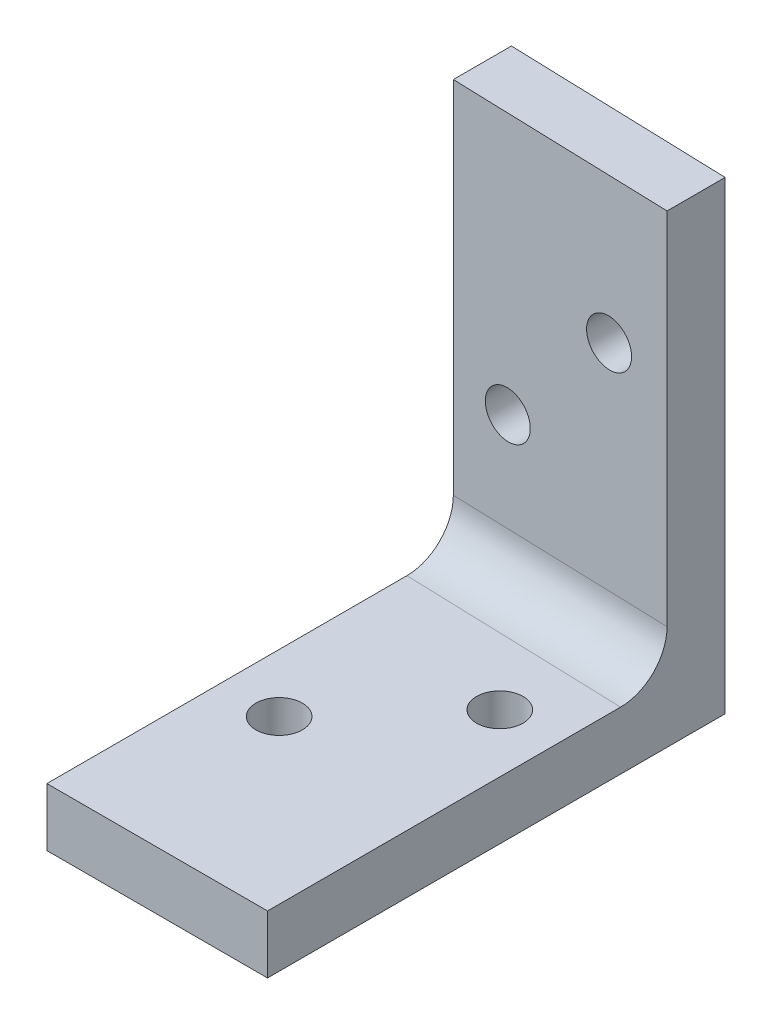
ISO-10303-21;
HEADER;
FILE_DESCRIPTION(('STEP AP214'),'2;1');
FILE_NAME('part.step','',(''),(''),'','','');
FILE_SCHEMA(('AUTOMOTIVE_DESIGN { 1 0 10303 214 1 1 1 1 }'));
ENDSEC;
DATA;
#1=APPLICATION_CONTEXT('core data for automotive mechanical design processes');
#2=APPLICATION_PROTOCOL_DEFINITION('international standard','automotive_design',2000,#1);
#3=PRODUCT_CONTEXT('',#1,'mechanical');
#4=PRODUCT('Part','Part','',(#3));
#5=PRODUCT_RELATED_PRODUCT_CATEGORY('part','',(#4));
#6=PRODUCT_DEFINITION_FORMATION('','',#4);
#7=PRODUCT_DEFINITION_CONTEXT('part definition',#1,'design');
#8=PRODUCT_DEFINITION('design','',#6,#7);
#9=PRODUCT_DEFINITION_SHAPE('','',#8);
#10=(LENGTH_UNIT() NAMED_UNIT(*) SI_UNIT(.MILLI.,.METRE.));
#11=(NAMED_UNIT(*) PLANE_ANGLE_UNIT() SI_UNIT($,.RADIAN.));
#12=(NAMED_UNIT(*) SI_UNIT($,.STERADIAN.) SOLID_ANGLE_UNIT());
#13=UNCERTAINTY_MEASURE_WITH_UNIT(LENGTH_MEASURE(1.E-05),#10,'distance_accuracy_value','');
#14=(GEOMETRIC_REPRESENTATION_CONTEXT(3) GLOBAL_UNCERTAINTY_ASSIGNED_CONTEXT((#13)) GLOBAL_UNIT_ASSIGNED_CONTEXT((#10,
#11,#12)) REPRESENTATION_CONTEXT('',''));
#15=CARTESIAN_POINT('',(0.,0.,0.));
#16=DIRECTION('',(0.,0.,1.));
#17=DIRECTION('',(1.,0.,0.));
#18=AXIS2_PLACEMENT_3D('',#15,#16,#17);
#19=CARTESIAN_POINT('',(0.,5.,0.));
#20=DIRECTION('',(0.,-1.,0.));
#21=DIRECTION('',(0.,0.,-1.));
#22=AXIS2_PLACEMENT_3D('',#19,#20,#21);
#23=PLANE('',#22);
#24=CARTESIAN_POINT('',(-4.5,5.,5.));
#25=DIRECTION('',(0.,1.,0.));
#26=DIRECTION('',(0.,0.,1.));
#27=AXIS2_PLACEMENT_3D('',#24,#25,#26);
#28=CIRCLE('',#27,2.);
#29=CARTESIAN_POINT('',(-4.5,5.,7.));
#30=VERTEX_POINT('',#29);
#31=EDGE_CURVE('E199',#30,#30,#28,.T.);
#32=ORIENTED_EDGE('',*,*,#31,.F.);
#33=EDGE_LOOP('',(#32));
#34=FACE_BOUND('',#33,.T.);
#35=CARTESIAN_POINT('',(4.5,5.,-5.));
#36=DIRECTION('',(0.,1.,0.));
#37=DIRECTION('',(0.,0.,1.));
#38=AXIS2_PLACEMENT_3D('',#35,#36,#37);
#39=CIRCLE('',#38,2.);
#40=CARTESIAN_POINT('',(4.5,5.,-3.));
#41=VERTEX_POINT('',#40);
#42=EDGE_CURVE('E195',#41,#41,#39,.T.);
#43=ORIENTED_EDGE('',*,*,#42,.F.);
#44=EDGE_LOOP('',(#43));
#45=FACE_BOUND('',#44,.T.);
#46=DIRECTION('',(0.,0.,-1.));
#47=VECTOR('',#46,1.);
#48=CARTESIAN_POINT('',(9.5,5.,20.));
#49=LINE('',#48,#47);
#50=CARTESIAN_POINT('',(9.5,5.,20.));
#51=VERTEX_POINT('',#50);
#52=CARTESIAN_POINT('',(9.5,5.,-10.4009262122279));
#53=VERTEX_POINT('',#52);
#54=EDGE_CURVE('E142',#51,#53,#49,.T.);
#55=ORIENTED_EDGE('',*,*,#54,.T.);
#56=DIRECTION('',(0.999506560365732,0.,0.0314107590781211));
#57=VECTOR('',#56,1.);
#58=CARTESIAN_POINT('',(-9.62564303631249,5.,-11.0019737585371));
#59=LINE('',#58,#57);
#60=CARTESIAN_POINT('',(-9.5,5.,-10.9980252670514));
#61=VERTEX_POINT('',#60);
#62=EDGE_CURVE('E64',#53,#61,#59,.F.);
#63=ORIENTED_EDGE('',*,*,#62,.T.);
#64=DIRECTION('',(0.,0.,1.));
#65=VECTOR('',#64,1.);
#66=CARTESIAN_POINT('',(-9.5,5.,20.));
#67=LINE('',#66,#65);
#68=CARTESIAN_POINT('',(-9.5,5.,20.));
#69=VERTEX_POINT('',#68);
#70=EDGE_CURVE('E145',#61,#69,#67,.T.);
#71=ORIENTED_EDGE('',*,*,#70,.T.);
#72=DIRECTION('',(1.,0.,0.));
#73=VECTOR('',#72,1.);
#74=CARTESIAN_POINT('',(-9.5,5.,20.));
#75=LINE('',#74,#73);
#76=EDGE_CURVE('E149',#69,#51,#75,.T.);
#77=ORIENTED_EDGE('',*,*,#76,.T.);
#78=EDGE_LOOP('',(#55,#63,#71,#77));
#79=FACE_BOUND('',#78,.T.);
#80=ADVANCED_FACE('F42',(#34,#45,#79),#23,.F.);
#81=CARTESIAN_POINT('',(9.5,5.,20.));
#82=DIRECTION('',(-1.,0.,0.));
#83=DIRECTION('',(0.,0.,1.));
#84=AXIS2_PLACEMENT_3D('',#81,#82,#83);
#85=PLANE('',#84);
#86=DIRECTION('',(0.,0.,-1.));
#87=VECTOR('',#86,1.);
#88=CARTESIAN_POINT('',(9.5,0.,20.));
#89=LINE('',#88,#87);
#90=CARTESIAN_POINT('',(9.5,0.,20.));
#91=VERTEX_POINT('',#90);
#92=CARTESIAN_POINT('',(9.5,0.,-19.4029009451765));
#93=VERTEX_POINT('',#92);
#94=EDGE_CURVE('E141',#91,#93,#89,.T.);
#95=ORIENTED_EDGE('',*,*,#94,.T.);
#96=DIRECTION('',(0.,1.,0.));
#97=VECTOR('',#96,1.);
#98=CARTESIAN_POINT('',(9.5,0.,-19.4029009451765));
#99=LINE('',#98,#97);
#100=CARTESIAN_POINT('',(9.5,40.,-19.4029009451765));
#101=VERTEX_POINT('',#100);
#102=EDGE_CURVE('E134',#93,#101,#99,.T.);
#103=ORIENTED_EDGE('',*,*,#102,.T.);
#104=DIRECTION('',(0.,0.,-1.));
#105=VECTOR('',#104,1.);
#106=CARTESIAN_POINT('',(9.5,40.,-19.4029009451765));
#107=LINE('',#106,#105);
#108=CARTESIAN_POINT('',(9.5,40.,-14.4029009451765));
#109=VERTEX_POINT('',#108);
#110=EDGE_CURVE('E113',#109,#101,#107,.T.);
#111=ORIENTED_EDGE('',*,*,#110,.F.);
#112=DIRECTION('',(0.,-1.,0.));
#113=VECTOR('',#112,1.);
#114=CARTESIAN_POINT('',(9.5,40.,-14.4029009451765));
#115=LINE('',#114,#113);
#116=CARTESIAN_POINT('',(9.5,9.,-14.4029009451765));
#117=VERTEX_POINT('',#116);
#118=EDGE_CURVE('E108',#109,#117,#115,.T.);
#119=ORIENTED_EDGE('',*,*,#118,.T.);
#120=CARTESIAN_POINT('',(9.5,9.,-10.4009262122279));
#121=DIRECTION('',(-1.,0.,0.));
#122=DIRECTION('',(0.,0.,-1.));
#123=AXIS2_PLACEMENT_3D('',#120,#121,#122);
#124=ELLIPSE('',#123,4.00197473294858,4.);
#125=EDGE_CURVE('E51',#117,#53,#124,.T.);
#126=ORIENTED_EDGE('',*,*,#125,.T.);
#127=ORIENTED_EDGE('',*,*,#54,.F.);
#128=DIRECTION('',(0.,-1.,0.));
#129=VECTOR('',#128,1.);
#130=CARTESIAN_POINT('',(9.5,5.,20.));
#131=LINE('',#130,#129);
#132=EDGE_CURVE('E152',#51,#91,#131,.T.);
#133=ORIENTED_EDGE('',*,*,#132,.T.);
#134=EDGE_LOOP('',(#95,#103,#111,#119,#126,#127,#133));
#135=FACE_BOUND('',#134,.T.);
#136=ADVANCED_FACE('F187',(#135),#85,.F.);
#137=CARTESIAN_POINT('',(-9.5,5.,20.));
#138=DIRECTION('',(1.,0.,0.));
#139=DIRECTION('',(0.,0.,-1.));
#140=AXIS2_PLACEMENT_3D('',#137,#138,#139);
#141=PLANE('',#140);
#142=DIRECTION('',(0.,0.,1.));
#143=VECTOR('',#142,1.);
#144=CARTESIAN_POINT('',(-9.5,0.,20.));
#145=LINE('',#144,#143);
#146=CARTESIAN_POINT('',(-9.5,0.,-20.));
#147=VERTEX_POINT('',#146);
#148=CARTESIAN_POINT('',(-9.5,0.,20.));
#149=VERTEX_POINT('',#148);
#150=EDGE_CURVE('E156',#147,#149,#145,.T.);
#151=ORIENTED_EDGE('',*,*,#150,.T.);
#152=DIRECTION('',(0.,-1.,0.));
#153=VECTOR('',#152,1.);
#154=CARTESIAN_POINT('',(-9.5,5.,20.));
#155=LINE('',#154,#153);
#156=EDGE_CURVE('E164',#69,#149,#155,.T.);
#157=ORIENTED_EDGE('',*,*,#156,.F.);
#158=ORIENTED_EDGE('',*,*,#70,.F.);
#159=CARTESIAN_POINT('',(-9.5,9.,-10.9980252670514));
#160=DIRECTION('',(1.,0.,0.));
#161=DIRECTION('',(0.,0.,-1.));
#162=AXIS2_PLACEMENT_3D('',#159,#160,#161);
#163=ELLIPSE('',#162,4.00197473294858,4.);
#164=CARTESIAN_POINT('',(-9.5,9.,-15.));
#165=VERTEX_POINT('',#164);
#166=EDGE_CURVE('E11',#61,#165,#163,.T.);
#167=ORIENTED_EDGE('',*,*,#166,.T.);
#168=DIRECTION('',(0.,-1.,0.));
#169=VECTOR('',#168,1.);
#170=CARTESIAN_POINT('',(-9.5,40.,-15.));
#171=LINE('',#170,#169);
#172=CARTESIAN_POINT('',(-9.5,40.,-15.));
#173=VERTEX_POINT('',#172);
#174=EDGE_CURVE('E106',#173,#165,#171,.T.);
#175=ORIENTED_EDGE('',*,*,#174,.F.);
#176=DIRECTION('',(0.,0.,1.));
#177=VECTOR('',#176,1.);
#178=CARTESIAN_POINT('',(-9.5,40.,-15.));
#179=LINE('',#178,#177);
#180=CARTESIAN_POINT('',(-9.5,40.,-20.));
#181=VERTEX_POINT('',#180);
#182=EDGE_CURVE('E114',#181,#173,#179,.T.);
#183=ORIENTED_EDGE('',*,*,#182,.F.);
#184=DIRECTION('',(0.,-1.,0.));
#185=VECTOR('',#184,1.);
#186=CARTESIAN_POINT('',(-9.5,5.,-20.));
#187=LINE('',#186,#185);
#188=EDGE_CURVE('E168',#181,#147,#187,.T.);
#189=ORIENTED_EDGE('',*,*,#188,.T.);
#190=EDGE_LOOP('',(#151,#157,#158,#167,#175,#183,#189));
#191=FACE_BOUND('',#190,.T.);
#192=ADVANCED_FACE('F126',(#191),#141,.F.);
#193=CARTESIAN_POINT('',(-9.5,5.,20.));
#194=DIRECTION('',(0.,0.,-1.));
#195=DIRECTION('',(-1.,0.,0.));
#196=AXIS2_PLACEMENT_3D('',#193,#194,#195);
#197=PLANE('',#196);
#198=DIRECTION('',(1.,0.,0.));
#199=VECTOR('',#198,1.);
#200=CARTESIAN_POINT('',(-9.5,0.,20.));
#201=LINE('',#200,#199);
#202=EDGE_CURVE('E146',#149,#91,#201,.T.);
#203=ORIENTED_EDGE('',*,*,#202,.T.);
#204=ORIENTED_EDGE('',*,*,#132,.F.);
#205=ORIENTED_EDGE('',*,*,#76,.F.);
#206=ORIENTED_EDGE('',*,*,#156,.T.);
#207=EDGE_LOOP('',(#203,#204,#205,#206));
#208=FACE_BOUND('',#207,.T.);
#209=ADVANCED_FACE('F231',(#208),#197,.F.);
#210=CARTESIAN_POINT('',(0.,0.,0.));
#211=DIRECTION('',(0.,-1.,0.));
#212=DIRECTION('',(0.,0.,-1.));
#213=AXIS2_PLACEMENT_3D('',#210,#211,#212);
#214=PLANE('',#213);
#215=CARTESIAN_POINT('',(-4.5,0.,5.));
#216=DIRECTION('',(0.,1.,0.));
#217=DIRECTION('',(0.,0.,1.));
#218=AXIS2_PLACEMENT_3D('',#215,#216,#217);
#219=CIRCLE('',#218,2.);
#220=CARTESIAN_POINT('',(-4.5,0.,7.));
#221=VERTEX_POINT('',#220);
#222=EDGE_CURVE('E124',#221,#221,#219,.T.);
#223=ORIENTED_EDGE('',*,*,#222,.T.);
#224=EDGE_LOOP('',(#223));
#225=FACE_BOUND('',#224,.T.);
#226=CARTESIAN_POINT('',(4.5,0.,-5.));
#227=DIRECTION('',(0.,1.,0.));
#228=DIRECTION('',(0.,0.,1.));
#229=AXIS2_PLACEMENT_3D('',#226,#227,#228);
#230=CIRCLE('',#229,2.);
#231=CARTESIAN_POINT('',(4.5,0.,-3.));
#232=VERTEX_POINT('',#231);
#233=EDGE_CURVE('E181',#232,#232,#230,.T.);
#234=ORIENTED_EDGE('',*,*,#233,.T.);
#235=EDGE_LOOP('',(#234));
#236=FACE_BOUND('',#235,.T.);
#237=DIRECTION('',(0.999506560365732,0.,0.0314107590781213));
#238=VECTOR('',#237,1.);
#239=CARTESIAN_POINT('',(-9.5,0.,-20.));
#240=LINE('',#239,#238);
#241=EDGE_CURVE('E129',#147,#93,#240,.T.);
#242=ORIENTED_EDGE('',*,*,#241,.T.);
#243=ORIENTED_EDGE('',*,*,#94,.F.);
#244=ORIENTED_EDGE('',*,*,#202,.F.);
#245=ORIENTED_EDGE('',*,*,#150,.F.);
#246=EDGE_LOOP('',(#242,#243,#244,#245));
#247=FACE_BOUND('',#246,.T.);
#248=ADVANCED_FACE('F220',(#225,#236,#247),#214,.T.);
#249=CARTESIAN_POINT('',(-9.5,0.,-20.));
#250=DIRECTION('',(-0.0314107590781213,0.,0.999506560365732));
#251=DIRECTION('',(0.999506560365732,0.,0.0314107590781213));
#252=AXIS2_PLACEMENT_3D('',#249,#250,#251);
#253=PLANE('',#252);
#254=CARTESIAN_POINT('',(4.50246719817134,27.5,-19.5599547405671));
#255=DIRECTION('',(0.0314107590781213,0.,-0.999506560365732));
#256=DIRECTION('',(-0.999506560365732,0.,-0.0314107590781213));
#257=AXIS2_PLACEMENT_3D('',#254,#255,#256);
#258=CIRCLE('',#257,2.);
#259=CARTESIAN_POINT('',(2.50345407743987,27.5,-19.6227762587233));
#260=VERTEX_POINT('',#259);
#261=EDGE_CURVE('E177',#260,#260,#258,.T.);
#262=ORIENTED_EDGE('',*,*,#261,.F.);
#263=EDGE_LOOP('',(#262));
#264=FACE_BOUND('',#263,.T.);
#265=CARTESIAN_POINT('',(-4.50246719817134,17.5,-19.8429462046094));
#266=DIRECTION('',(0.0314107590781213,0.,-0.999506560365732));
#267=DIRECTION('',(-0.999506560365732,0.,-0.0314107590781213));
#268=AXIS2_PLACEMENT_3D('',#265,#266,#267);
#269=CIRCLE('',#268,2.);
#270=CARTESIAN_POINT('',(-6.5014803189028,17.5,-19.9057677227656));
#271=VERTEX_POINT('',#270);
#272=EDGE_CURVE('E206',#271,#271,#269,.T.);
#273=ORIENTED_EDGE('',*,*,#272,.F.);
#274=EDGE_LOOP('',(#273));
#275=FACE_BOUND('',#274,.T.);
#276=ORIENTED_EDGE('',*,*,#188,.F.);
#277=DIRECTION('',(-0.999506560365732,0.,-0.0314107590781213));
#278=VECTOR('',#277,1.);
#279=CARTESIAN_POINT('',(-9.5,40.,-20.));
#280=LINE('',#279,#278);
#281=EDGE_CURVE('E120',#101,#181,#280,.T.);
#282=ORIENTED_EDGE('',*,*,#281,.F.);
#283=ORIENTED_EDGE('',*,*,#102,.F.);
#284=ORIENTED_EDGE('',*,*,#241,.F.);
#285=EDGE_LOOP('',(#276,#282,#283,#284));
#286=FACE_BOUND('',#285,.T.);
#287=ADVANCED_FACE('F217',(#264,#275,#286),#253,.F.);
#288=CARTESIAN_POINT('',(9.5,40.,-14.4029009451765));
#289=DIRECTION('',(0.0314107590781211,0.,-0.999506560365732));
#290=DIRECTION('',(-0.999506560365732,0.,-0.0314107590781211));
#291=AXIS2_PLACEMENT_3D('',#288,#289,#290);
#292=PLANE('',#291);
#293=CARTESIAN_POINT('',(4.34549089934809,27.5,-14.5648879194964));
#294=DIRECTION('',(0.0314107590781211,0.,-0.999506560365732));
#295=DIRECTION('',(-0.999506560365732,0.,-0.0314107590781211));
#296=AXIS2_PLACEMENT_3D('',#293,#294,#295);
#297=CIRCLE('',#296,2.);
#298=CARTESIAN_POINT('',(2.34647777861663,27.5,-14.6277094376526));
#299=VERTEX_POINT('',#298);
#300=EDGE_CURVE('E176',#299,#299,#297,.T.);
#301=ORIENTED_EDGE('',*,*,#300,.T.);
#302=EDGE_LOOP('',(#301));
#303=FACE_BOUND('',#302,.T.);
#304=CARTESIAN_POINT('',(-4.65944349699459,17.5,-14.8478793835387));
#305=DIRECTION('',(0.0314107590781211,0.,-0.999506560365732));
#306=DIRECTION('',(-0.999506560365732,0.,-0.0314107590781211));
#307=AXIS2_PLACEMENT_3D('',#304,#305,#306);
#308=CIRCLE('',#307,2.);
#309=CARTESIAN_POINT('',(-6.65845661772605,17.5,-14.910700901695));
#310=VERTEX_POINT('',#309);
#311=EDGE_CURVE('E172',#310,#310,#308,.T.);
#312=ORIENTED_EDGE('',*,*,#311,.T.);
#313=EDGE_LOOP('',(#312));
#314=FACE_BOUND('',#313,.T.);
#315=ORIENTED_EDGE('',*,*,#174,.T.);
#316=DIRECTION('',(0.999506560365732,0.,0.0314107590781211));
#317=VECTOR('',#316,1.);
#318=CARTESIAN_POINT('',(9.5,9.,-14.4029009451765));
#319=LINE('',#318,#317);
#320=EDGE_CURVE('E171',#165,#117,#319,.T.);
#321=ORIENTED_EDGE('',*,*,#320,.T.);
#322=ORIENTED_EDGE('',*,*,#118,.F.);
#323=DIRECTION('',(0.999506560365732,0.,0.0314107590781211));
#324=VECTOR('',#323,1.);
#325=CARTESIAN_POINT('',(9.5,40.,-14.4029009451765));
#326=LINE('',#325,#324);
#327=EDGE_CURVE('E101',#173,#109,#326,.T.);
#328=ORIENTED_EDGE('',*,*,#327,.F.);
#329=EDGE_LOOP('',(#315,#321,#322,#328));
#330=FACE_BOUND('',#329,.T.);
#331=ADVANCED_FACE('F103',(#303,#314,#330),#292,.F.);
#332=CARTESIAN_POINT('',(0.,40.,0.));
#333=DIRECTION('',(0.,-1.,0.));
#334=DIRECTION('',(0.,0.,-1.));
#335=AXIS2_PLACEMENT_3D('',#332,#333,#334);
#336=PLANE('',#335);
#337=ORIENTED_EDGE('',*,*,#182,.T.);
#338=ORIENTED_EDGE('',*,*,#327,.T.);
#339=ORIENTED_EDGE('',*,*,#110,.T.);
#340=ORIENTED_EDGE('',*,*,#281,.T.);
#341=EDGE_LOOP('',(#337,#338,#339,#340));
#342=FACE_BOUND('',#341,.T.);
#343=ADVANCED_FACE('F118',(#342),#336,.F.);
#344=CARTESIAN_POINT('',(4.5,0.,-5.));
#345=DIRECTION('',(0.,1.,0.));
#346=DIRECTION('',(0.,0.,1.));
#347=AXIS2_PLACEMENT_3D('',#344,#345,#346);
#348=CYLINDRICAL_SURFACE('',#347,2.);
#349=ORIENTED_EDGE('',*,*,#233,.F.);
#350=EDGE_LOOP('',(#349));
#351=FACE_BOUND('',#350,.T.);
#352=ORIENTED_EDGE('',*,*,#42,.T.);
#353=EDGE_LOOP('',(#352));
#354=FACE_BOUND('',#353,.T.);
#355=ADVANCED_FACE('F286',(#351,#354),#348,.F.);
#356=CARTESIAN_POINT('',(-4.5,0.,5.));
#357=DIRECTION('',(0.,1.,0.));
#358=DIRECTION('',(0.,0.,1.));
#359=AXIS2_PLACEMENT_3D('',#356,#357,#358);
#360=CYLINDRICAL_SURFACE('',#359,2.);
#361=ORIENTED_EDGE('',*,*,#222,.F.);
#362=EDGE_LOOP('',(#361));
#363=FACE_BOUND('',#362,.T.);
#364=ORIENTED_EDGE('',*,*,#31,.T.);
#365=EDGE_LOOP('',(#364));
#366=FACE_BOUND('',#365,.T.);
#367=ADVANCED_FACE('F292',(#363,#366),#360,.F.);
#368=CARTESIAN_POINT('',(-5.75827758875733,17.5,20.1175883639561));
#369=DIRECTION('',(0.0314107590781213,0.,-0.999506560365732));
#370=DIRECTION('',(-0.999506560365732,0.,-0.0314107590781213));
#371=AXIS2_PLACEMENT_3D('',#368,#369,#370);
#372=CYLINDRICAL_SURFACE('',#371,2.);
#373=ORIENTED_EDGE('',*,*,#272,.T.);
#374=EDGE_LOOP('',(#373));
#375=FACE_BOUND('',#374,.T.);
#376=ORIENTED_EDGE('',*,*,#311,.F.);
#377=EDGE_LOOP('',(#376));
#378=FACE_BOUND('',#377,.T.);
#379=ADVANCED_FACE('F237',(#375,#378),#372,.F.);
#380=CARTESIAN_POINT('',(3.24665680758535,27.5,20.4005798279984));
#381=DIRECTION('',(0.0314107590781213,0.,-0.999506560365732));
#382=DIRECTION('',(-0.999506560365732,0.,-0.0314107590781213));
#383=AXIS2_PLACEMENT_3D('',#380,#381,#382);
#384=CYLINDRICAL_SURFACE('',#383,2.);
#385=ORIENTED_EDGE('',*,*,#261,.T.);
#386=EDGE_LOOP('',(#385));
#387=FACE_BOUND('',#386,.T.);
#388=ORIENTED_EDGE('',*,*,#300,.F.);
#389=EDGE_LOOP('',(#388));
#390=FACE_BOUND('',#389,.T.);
#391=ADVANCED_FACE('F214',(#387,#390),#384,.F.);
#392=CARTESIAN_POINT('',(9.37435696368752,9.,-10.4048747037135));
#393=DIRECTION('',(-0.999506560365732,0.,-0.0314107590781211));
#394=DIRECTION('',(-0.0314107590781211,0.,0.999506560365732));
#395=AXIS2_PLACEMENT_3D('',#392,#393,#394);
#396=CYLINDRICAL_SURFACE('',#395,4.);
#397=ORIENTED_EDGE('',*,*,#166,.F.);
#398=ORIENTED_EDGE('',*,*,#62,.F.);
#399=ORIENTED_EDGE('',*,*,#125,.F.);
#400=ORIENTED_EDGE('',*,*,#320,.F.);
#401=EDGE_LOOP('',(#397,#398,#399,#400));
#402=FACE_BOUND('',#401,.T.);
#403=ADVANCED_FACE('F44',(#402),#396,.F.);
#404=CLOSED_SHELL('',(#80,#136,#192,#209,#248,#287,#331,#343,#355,#367,#379,#391,#403));
#405=MANIFOLD_SOLID_BREP('B2',#404);
#406=ADVANCED_BREP_SHAPE_REPRESENTATION('',(#18,#405),#14);
#407=SHAPE_DEFINITION_REPRESENTATION(#9,#406);
ENDSEC;
END-ISO-10303-21;
